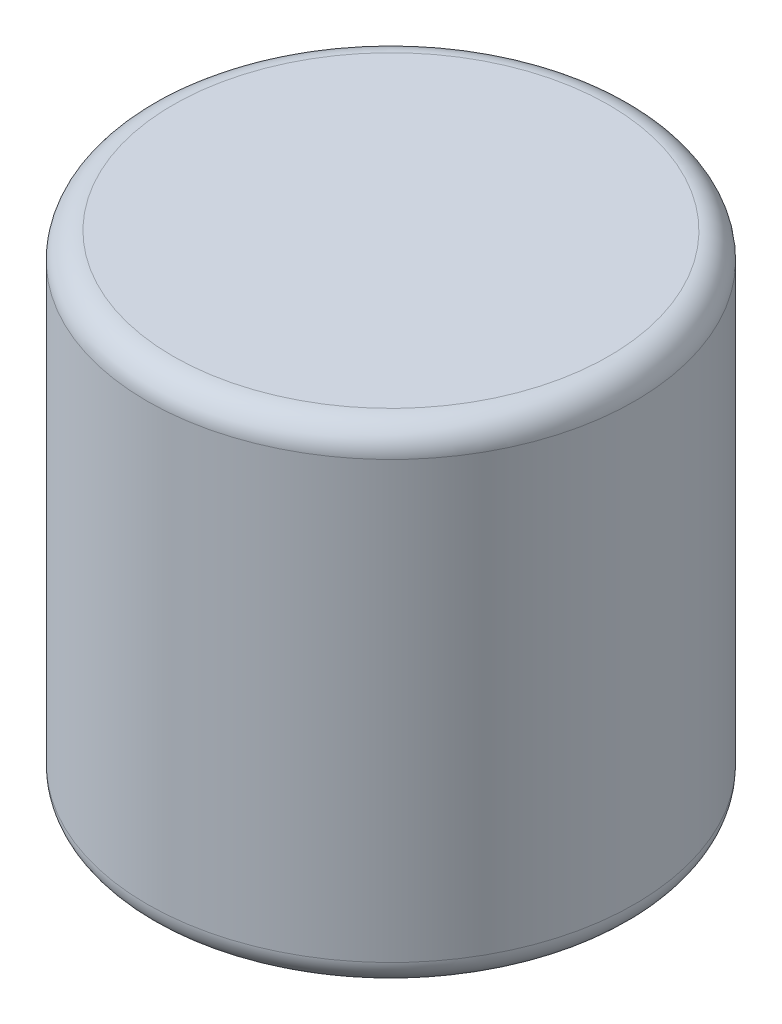
ISO-10303-21;
HEADER;
FILE_DESCRIPTION(('STEP AP214'),'2;1');
FILE_NAME('part.step','',(''),(''),'','','');
FILE_SCHEMA(('AUTOMOTIVE_DESIGN { 1 0 10303 214 1 1 1 1 }'));
ENDSEC;
DATA;
#1=APPLICATION_CONTEXT('core data for automotive mechanical design processes');
#2=APPLICATION_PROTOCOL_DEFINITION('international standard','automotive_design',2000,#1);
#3=PRODUCT_CONTEXT('',#1,'mechanical');
#4=PRODUCT('Part','Part','',(#3));
#5=PRODUCT_RELATED_PRODUCT_CATEGORY('part','',(#4));
#6=PRODUCT_DEFINITION_FORMATION('','',#4);
#7=PRODUCT_DEFINITION_CONTEXT('part definition',#1,'design');
#8=PRODUCT_DEFINITION('design','',#6,#7);
#9=PRODUCT_DEFINITION_SHAPE('','',#8);
#10=(LENGTH_UNIT() NAMED_UNIT(*) SI_UNIT(.MILLI.,.METRE.));
#11=(NAMED_UNIT(*) PLANE_ANGLE_UNIT() SI_UNIT($,.RADIAN.));
#12=(NAMED_UNIT(*) SI_UNIT($,.STERADIAN.) SOLID_ANGLE_UNIT());
#13=UNCERTAINTY_MEASURE_WITH_UNIT(LENGTH_MEASURE(1.E-05),#10,'distance_accuracy_value','');
#14=(GEOMETRIC_REPRESENTATION_CONTEXT(3) GLOBAL_UNCERTAINTY_ASSIGNED_CONTEXT((#13)) GLOBAL_UNIT_ASSIGNED_CONTEXT((#10,
#11,#12)) REPRESENTATION_CONTEXT('',''));
#15=CARTESIAN_POINT('',(0.,0.,0.));
#16=DIRECTION('',(0.,0.,1.));
#17=DIRECTION('',(1.,0.,0.));
#18=AXIS2_PLACEMENT_3D('',#15,#16,#17);
#19=CARTESIAN_POINT('',(0.,2.3876,0.));
#20=DIRECTION('',(0.,-1.,0.));
#21=DIRECTION('',(0.,0.,-1.));
#22=AXIS2_PLACEMENT_3D('',#19,#20,#21);
#23=CYLINDRICAL_SURFACE('',#22,2.3876);
#24=CARTESIAN_POINT('',(0.,-2.1336,0.));
#25=DIRECTION('',(0.,1.,0.));
#26=DIRECTION('',(0.,0.,1.));
#27=AXIS2_PLACEMENT_3D('',#24,#25,#26);
#28=CIRCLE('',#27,2.3876);
#29=CARTESIAN_POINT('',(0.,-2.1336,2.3876));
#30=VERTEX_POINT('',#29);
#31=EDGE_CURVE('E42',#30,#30,#28,.T.);
#32=ORIENTED_EDGE('',*,*,#31,.T.);
#33=EDGE_LOOP('',(#32));
#34=FACE_BOUND('',#33,.T.);
#35=CARTESIAN_POINT('',(0.,2.1336,0.));
#36=DIRECTION('',(0.,1.,0.));
#37=DIRECTION('',(0.,0.,1.));
#38=AXIS2_PLACEMENT_3D('',#35,#36,#37);
#39=CIRCLE('',#38,2.3876);
#40=CARTESIAN_POINT('',(0.,2.1336,2.3876));
#41=VERTEX_POINT('',#40);
#42=EDGE_CURVE('E46',#41,#41,#39,.F.);
#43=ORIENTED_EDGE('',*,*,#42,.T.);
#44=EDGE_LOOP('',(#43));
#45=FACE_BOUND('',#44,.T.);
#46=ADVANCED_FACE('F31',(#34,#45),#23,.T.);
#47=CARTESIAN_POINT('',(0.,2.3876,0.));
#48=DIRECTION('',(0.,1.,0.));
#49=DIRECTION('',(0.,0.,1.));
#50=AXIS2_PLACEMENT_3D('',#47,#48,#49);
#51=PLANE('',#50);
#52=CARTESIAN_POINT('',(0.,2.3876,0.));
#53=DIRECTION('',(0.,1.,0.));
#54=DIRECTION('',(0.,0.,1.));
#55=AXIS2_PLACEMENT_3D('',#52,#53,#54);
#56=CIRCLE('',#55,2.1336);
#57=CARTESIAN_POINT('',(0.,2.3876,2.1336));
#58=VERTEX_POINT('',#57);
#59=EDGE_CURVE('E10',#58,#58,#56,.T.);
#60=ORIENTED_EDGE('',*,*,#59,.T.);
#61=EDGE_LOOP('',(#60));
#62=FACE_BOUND('',#61,.T.);
#63=ADVANCED_FACE('F62',(#62),#51,.T.);
#64=CARTESIAN_POINT('',(0.,-2.3876,0.));
#65=DIRECTION('',(0.,1.,0.));
#66=DIRECTION('',(0.,0.,1.));
#67=AXIS2_PLACEMENT_3D('',#64,#65,#66);
#68=PLANE('',#67);
#69=CARTESIAN_POINT('',(0.,-2.3876,0.));
#70=DIRECTION('',(0.,1.,0.));
#71=DIRECTION('',(0.,0.,1.));
#72=AXIS2_PLACEMENT_3D('',#69,#70,#71);
#73=CIRCLE('',#72,2.1336);
#74=CARTESIAN_POINT('',(0.,-2.3876,2.1336));
#75=VERTEX_POINT('',#74);
#76=EDGE_CURVE('E38',#75,#75,#73,.F.);
#77=ORIENTED_EDGE('',*,*,#76,.T.);
#78=EDGE_LOOP('',(#77));
#79=FACE_BOUND('',#78,.T.);
#80=ADVANCED_FACE('F59',(#79),#68,.F.);
#81=CARTESIAN_POINT('',(0.,-2.1336,0.));
#82=DIRECTION('',(0.,1.,0.));
#83=DIRECTION('',(0.,0.,1.));
#84=AXIS2_PLACEMENT_3D('',#81,#82,#83);
#85=TOROIDAL_SURFACE('',#84,2.1336,0.254);
#86=ORIENTED_EDGE('',*,*,#76,.F.);
#87=EDGE_LOOP('',(#86));
#88=FACE_BOUND('',#87,.T.);
#89=ORIENTED_EDGE('',*,*,#31,.F.);
#90=EDGE_LOOP('',(#89));
#91=FACE_BOUND('',#90,.T.);
#92=ADVANCED_FACE('F55',(#88,#91),#85,.T.);
#93=CARTESIAN_POINT('',(0.,2.1336,0.));
#94=DIRECTION('',(0.,1.,0.));
#95=DIRECTION('',(0.,0.,1.));
#96=AXIS2_PLACEMENT_3D('',#93,#94,#95);
#97=TOROIDAL_SURFACE('',#96,2.1336,0.254);
#98=ORIENTED_EDGE('',*,*,#42,.F.);
#99=EDGE_LOOP('',(#98));
#100=FACE_BOUND('',#99,.T.);
#101=ORIENTED_EDGE('',*,*,#59,.F.);
#102=EDGE_LOOP('',(#101));
#103=FACE_BOUND('',#102,.T.);
#104=ADVANCED_FACE('F33',(#100,#103),#97,.T.);
#105=CLOSED_SHELL('',(#46,#63,#80,#92,#104));
#106=MANIFOLD_SOLID_BREP('B2',#105);
#107=ADVANCED_BREP_SHAPE_REPRESENTATION('',(#18,#106),#14);
#108=SHAPE_DEFINITION_REPRESENTATION(#9,#107);
ENDSEC;
END-ISO-10303-21;
